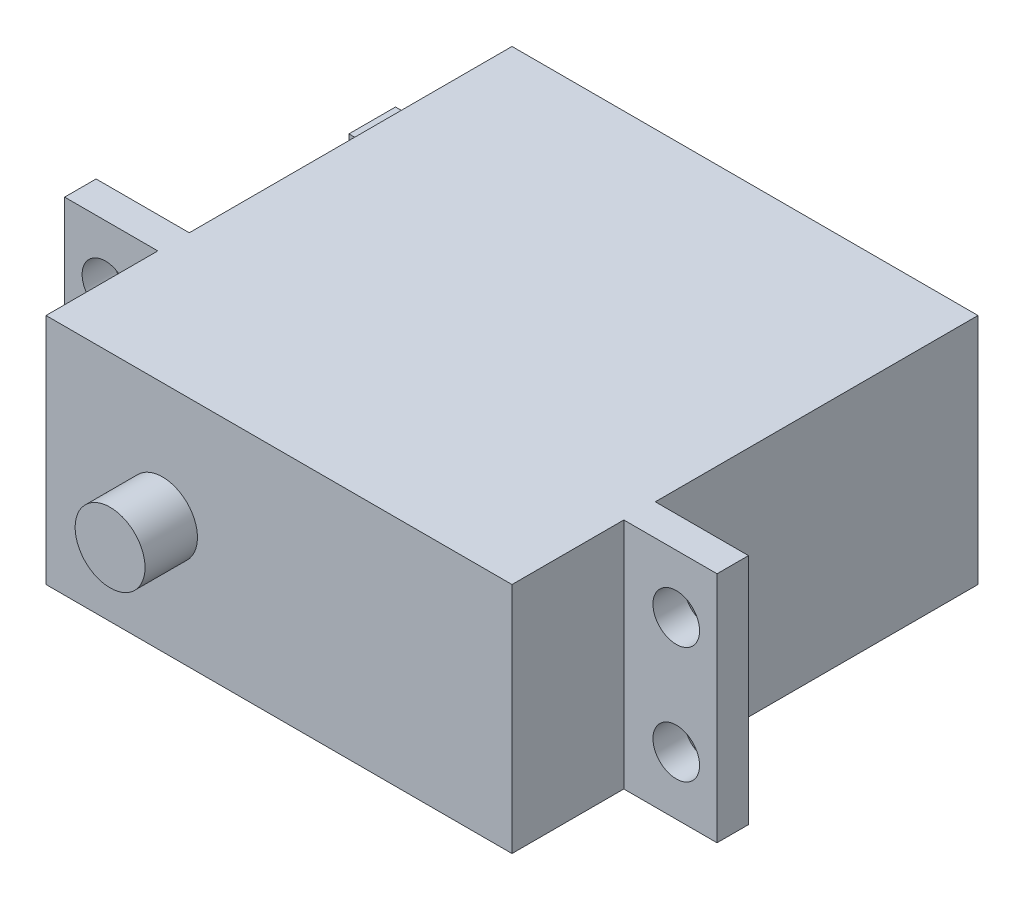
ISO-10303-21;
HEADER;
FILE_DESCRIPTION(('STEP AP214'),'2;1');
FILE_NAME('part.step','',(''),(''),'','','');
FILE_SCHEMA(('AUTOMOTIVE_DESIGN { 1 0 10303 214 1 1 1 1 }'));
ENDSEC;
DATA;
#1=APPLICATION_CONTEXT('core data for automotive mechanical design processes');
#2=APPLICATION_PROTOCOL_DEFINITION('international standard','automotive_design',2000,#1);
#3=PRODUCT_CONTEXT('',#1,'mechanical');
#4=PRODUCT('Part','Part','',(#3));
#5=PRODUCT_RELATED_PRODUCT_CATEGORY('part','',(#4));
#6=PRODUCT_DEFINITION_FORMATION('','',#4);
#7=PRODUCT_DEFINITION_CONTEXT('part definition',#1,'design');
#8=PRODUCT_DEFINITION('design','',#6,#7);
#9=PRODUCT_DEFINITION_SHAPE('','',#8);
#10=(LENGTH_UNIT() NAMED_UNIT(*) SI_UNIT(.MILLI.,.METRE.));
#11=(NAMED_UNIT(*) PLANE_ANGLE_UNIT() SI_UNIT($,.RADIAN.));
#12=(NAMED_UNIT(*) SI_UNIT($,.STERADIAN.) SOLID_ANGLE_UNIT());
#13=UNCERTAINTY_MEASURE_WITH_UNIT(LENGTH_MEASURE(1.E-05),#10,'distance_accuracy_value','');
#14=(GEOMETRIC_REPRESENTATION_CONTEXT(3) GLOBAL_UNCERTAINTY_ASSIGNED_CONTEXT((#13)) GLOBAL_UNIT_ASSIGNED_CONTEXT((#10,
#11,#12)) REPRESENTATION_CONTEXT('',''));
#15=CARTESIAN_POINT('',(0.,0.,0.));
#16=DIRECTION('',(0.,0.,1.));
#17=DIRECTION('',(1.,0.,0.));
#18=AXIS2_PLACEMENT_3D('',#15,#16,#17);
#19=CARTESIAN_POINT('',(0.,20.,0.));
#20=DIRECTION('',(1.,0.,0.));
#21=DIRECTION('',(0.,0.,-1.));
#22=AXIS2_PLACEMENT_3D('',#19,#20,#21);
#23=PLANE('',#22);
#24=DIRECTION('',(0.,-1.,0.));
#25=VECTOR('',#24,1.);
#26=CARTESIAN_POINT('',(-1.38777878078146E-13,0.,-12.3));
#27=LINE('',#26,#25);
#28=CARTESIAN_POINT('',(0.,20.,-12.3));
#29=VERTEX_POINT('',#28);
#30=CARTESIAN_POINT('',(-1.38777878078145E-13,2.22749336337148E-13,-12.3));
#31=VERTEX_POINT('',#30);
#32=EDGE_CURVE('E195',#29,#31,#27,.T.);
#33=ORIENTED_EDGE('',*,*,#32,.F.);
#34=DIRECTION('',(0.,0.,1.));
#35=VECTOR('',#34,1.);
#36=CARTESIAN_POINT('',(0.,20.,0.));
#37=LINE('',#36,#35);
#38=CARTESIAN_POINT('',(0.,20.,-40.));
#39=VERTEX_POINT('',#38);
#40=EDGE_CURVE('E304',#39,#29,#37,.T.);
#41=ORIENTED_EDGE('',*,*,#40,.F.);
#42=DIRECTION('',(0.,-1.,0.));
#43=VECTOR('',#42,1.);
#44=CARTESIAN_POINT('',(0.,20.,-40.));
#45=LINE('',#44,#43);
#46=CARTESIAN_POINT('',(0.,0.,-40.));
#47=VERTEX_POINT('',#46);
#48=EDGE_CURVE('E320',#39,#47,#45,.T.);
#49=ORIENTED_EDGE('',*,*,#48,.T.);
#50=DIRECTION('',(0.,0.,1.));
#51=VECTOR('',#50,1.);
#52=CARTESIAN_POINT('',(0.,0.,0.));
#53=LINE('',#52,#51);
#54=EDGE_CURVE('E321',#47,#31,#53,.T.);
#55=ORIENTED_EDGE('',*,*,#54,.T.);
#56=EDGE_LOOP('',(#33,#41,#49,#55));
#57=FACE_BOUND('',#56,.T.);
#58=DIRECTION('',(0.,0.,1.));
#59=VECTOR('',#58,1.);
#60=CARTESIAN_POINT('',(0.,6.5,0.));
#61=LINE('',#60,#59);
#62=CARTESIAN_POINT('',(0.,6.5,-37.));
#63=VERTEX_POINT('',#62);
#64=CARTESIAN_POINT('',(0.,6.5,-33.));
#65=VERTEX_POINT('',#64);
#66=EDGE_CURVE('E187',#63,#65,#61,.T.);
#67=ORIENTED_EDGE('',*,*,#66,.F.);
#68=DIRECTION('',(0.,1.,0.));
#69=VECTOR('',#68,1.);
#70=CARTESIAN_POINT('',(0.,0.,-37.));
#71=LINE('',#70,#69);
#72=CARTESIAN_POINT('',(0.,13.5,-37.));
#73=VERTEX_POINT('',#72);
#74=EDGE_CURVE('E183',#63,#73,#71,.T.);
#75=ORIENTED_EDGE('',*,*,#74,.T.);
#76=DIRECTION('',(0.,0.,1.));
#77=VECTOR('',#76,1.);
#78=CARTESIAN_POINT('',(0.,13.5,0.));
#79=LINE('',#78,#77);
#80=CARTESIAN_POINT('',(0.,13.5,-33.));
#81=VERTEX_POINT('',#80);
#82=EDGE_CURVE('E63',#73,#81,#79,.T.);
#83=ORIENTED_EDGE('',*,*,#82,.T.);
#84=DIRECTION('',(0.,1.,0.));
#85=VECTOR('',#84,1.);
#86=CARTESIAN_POINT('',(0.,0.,-33.));
#87=LINE('',#86,#85);
#88=EDGE_CURVE('E658',#65,#81,#87,.T.);
#89=ORIENTED_EDGE('',*,*,#88,.F.);
#90=EDGE_LOOP('',(#67,#75,#83,#89));
#91=FACE_BOUND('',#90,.T.);
#92=ADVANCED_FACE('F47',(#57,#91),#23,.F.);
#93=CARTESIAN_POINT('',(40.,20.,0.));
#94=DIRECTION('',(-1.,0.,0.));
#95=DIRECTION('',(0.,0.,1.));
#96=AXIS2_PLACEMENT_3D('',#93,#94,#95);
#97=PLANE('',#96);
#98=DIRECTION('',(0.,-1.,0.));
#99=VECTOR('',#98,1.);
#100=CARTESIAN_POINT('',(40.,0.,-9.6));
#101=LINE('',#100,#99);
#102=CARTESIAN_POINT('',(40.,20.,-9.6));
#103=VERTEX_POINT('',#102);
#104=CARTESIAN_POINT('',(40.,0.,-9.6));
#105=VERTEX_POINT('',#104);
#106=EDGE_CURVE('E205',#103,#105,#101,.T.);
#107=ORIENTED_EDGE('',*,*,#106,.F.);
#108=DIRECTION('',(0.,0.,-1.));
#109=VECTOR('',#108,1.);
#110=CARTESIAN_POINT('',(40.,20.,0.));
#111=LINE('',#110,#109);
#112=CARTESIAN_POINT('',(40.,20.,0.));
#113=VERTEX_POINT('',#112);
#114=EDGE_CURVE('E313',#113,#103,#111,.T.);
#115=ORIENTED_EDGE('',*,*,#114,.F.);
#116=DIRECTION('',(0.,-1.,0.));
#117=VECTOR('',#116,1.);
#118=CARTESIAN_POINT('',(40.,20.,0.));
#119=LINE('',#118,#117);
#120=CARTESIAN_POINT('',(40.,0.,0.));
#121=VERTEX_POINT('',#120);
#122=EDGE_CURVE('E342',#113,#121,#119,.T.);
#123=ORIENTED_EDGE('',*,*,#122,.T.);
#124=DIRECTION('',(0.,0.,-1.));
#125=VECTOR('',#124,1.);
#126=CARTESIAN_POINT('',(40.,0.,0.));
#127=LINE('',#126,#125);
#128=EDGE_CURVE('E329',#121,#105,#127,.T.);
#129=ORIENTED_EDGE('',*,*,#128,.T.);
#130=EDGE_LOOP('',(#107,#115,#123,#129));
#131=FACE_BOUND('',#130,.T.);
#132=ADVANCED_FACE('F364',(#131),#97,.F.);
#133=CARTESIAN_POINT('',(0.,20.,-9.6));
#134=VERTEX_POINT('',#133);
#135=CARTESIAN_POINT('',(0.,20.,0.));
#136=VERTEX_POINT('',#135);
#137=EDGE_CURVE('E309',#134,#136,#37,.T.);
#138=ORIENTED_EDGE('',*,*,#137,.F.);
#139=DIRECTION('',(0.,-1.,0.));
#140=VECTOR('',#139,1.);
#141=CARTESIAN_POINT('',(-1.38777878078146E-13,0.,-9.6));
#142=LINE('',#141,#140);
#143=CARTESIAN_POINT('',(0.,0.,-9.6));
#144=VERTEX_POINT('',#143);
#145=EDGE_CURVE('E259',#134,#144,#142,.T.);
#146=ORIENTED_EDGE('',*,*,#145,.T.);
#147=CARTESIAN_POINT('',(0.,0.,0.));
#148=VERTEX_POINT('',#147);
#149=EDGE_CURVE('E303',#144,#148,#53,.T.);
#150=ORIENTED_EDGE('',*,*,#149,.T.);
#151=DIRECTION('',(0.,-1.,0.));
#152=VECTOR('',#151,1.);
#153=CARTESIAN_POINT('',(0.,20.,0.));
#154=LINE('',#153,#152);
#155=EDGE_CURVE('E56',#136,#148,#154,.T.);
#156=ORIENTED_EDGE('',*,*,#155,.F.);
#157=EDGE_LOOP('',(#138,#146,#150,#156));
#158=FACE_BOUND('',#157,.T.);
#159=ADVANCED_FACE('F49',(#158),#23,.F.);
#160=CARTESIAN_POINT('',(0.,20.,0.));
#161=DIRECTION('',(0.,0.,-1.));
#162=DIRECTION('',(-1.,0.,0.));
#163=AXIS2_PLACEMENT_3D('',#160,#161,#162);
#164=PLANE('',#163);
#165=CARTESIAN_POINT('',(10.,10.,0.));
#166=DIRECTION('',(0.,0.,-1.));
#167=DIRECTION('',(-1.,0.,0.));
#168=AXIS2_PLACEMENT_3D('',#165,#166,#167);
#169=CIRCLE('',#168,3.);
#170=CARTESIAN_POINT('',(7.,10.,0.));
#171=VERTEX_POINT('',#170);
#172=EDGE_CURVE('E11',#171,#171,#169,.F.);
#173=ORIENTED_EDGE('',*,*,#172,.F.);
#174=EDGE_LOOP('',(#173));
#175=FACE_BOUND('',#174,.T.);
#176=DIRECTION('',(1.,0.,0.));
#177=VECTOR('',#176,1.);
#178=CARTESIAN_POINT('',(0.,0.,0.));
#179=LINE('',#178,#177);
#180=EDGE_CURVE('E325',#148,#121,#179,.T.);
#181=ORIENTED_EDGE('',*,*,#180,.T.);
#182=ORIENTED_EDGE('',*,*,#122,.F.);
#183=DIRECTION('',(1.,0.,0.));
#184=VECTOR('',#183,1.);
#185=CARTESIAN_POINT('',(0.,20.,0.));
#186=LINE('',#185,#184);
#187=EDGE_CURVE('E308',#136,#113,#186,.T.);
#188=ORIENTED_EDGE('',*,*,#187,.F.);
#189=ORIENTED_EDGE('',*,*,#155,.T.);
#190=EDGE_LOOP('',(#181,#182,#188,#189));
#191=FACE_BOUND('',#190,.T.);
#192=ADVANCED_FACE('F350',(#175,#191),#164,.F.);
#193=CARTESIAN_POINT('',(40.,20.,-12.3));
#194=VERTEX_POINT('',#193);
#195=CARTESIAN_POINT('',(40.,20.,-40.));
#196=VERTEX_POINT('',#195);
#197=EDGE_CURVE('E312',#194,#196,#111,.T.);
#198=ORIENTED_EDGE('',*,*,#197,.F.);
#199=DIRECTION('',(0.,-1.,0.));
#200=VECTOR('',#199,1.);
#201=CARTESIAN_POINT('',(40.,0.,-12.3));
#202=LINE('',#201,#200);
#203=CARTESIAN_POINT('',(40.,0.,-12.3));
#204=VERTEX_POINT('',#203);
#205=EDGE_CURVE('E230',#194,#204,#202,.T.);
#206=ORIENTED_EDGE('',*,*,#205,.T.);
#207=CARTESIAN_POINT('',(40.,0.,-40.));
#208=VERTEX_POINT('',#207);
#209=EDGE_CURVE('E328',#204,#208,#127,.T.);
#210=ORIENTED_EDGE('',*,*,#209,.T.);
#211=DIRECTION('',(0.,-1.,0.));
#212=VECTOR('',#211,1.);
#213=CARTESIAN_POINT('',(40.,20.,-40.));
#214=LINE('',#213,#212);
#215=EDGE_CURVE('E338',#196,#208,#214,.T.);
#216=ORIENTED_EDGE('',*,*,#215,.F.);
#217=EDGE_LOOP('',(#198,#206,#210,#216));
#218=FACE_BOUND('',#217,.T.);
#219=ADVANCED_FACE('F385',(#218),#97,.F.);
#220=CARTESIAN_POINT('',(0.,20.,-40.));
#221=DIRECTION('',(0.,0.,1.));
#222=DIRECTION('',(1.,0.,0.));
#223=AXIS2_PLACEMENT_3D('',#220,#221,#222);
#224=PLANE('',#223);
#225=DIRECTION('',(-1.,0.,0.));
#226=VECTOR('',#225,1.);
#227=CARTESIAN_POINT('',(0.,0.,-40.));
#228=LINE('',#227,#226);
#229=EDGE_CURVE('E332',#208,#47,#228,.T.);
#230=ORIENTED_EDGE('',*,*,#229,.T.);
#231=ORIENTED_EDGE('',*,*,#48,.F.);
#232=DIRECTION('',(-1.,0.,0.));
#233=VECTOR('',#232,1.);
#234=CARTESIAN_POINT('',(0.,20.,-40.));
#235=LINE('',#234,#233);
#236=EDGE_CURVE('E317',#196,#39,#235,.T.);
#237=ORIENTED_EDGE('',*,*,#236,.F.);
#238=ORIENTED_EDGE('',*,*,#215,.T.);
#239=EDGE_LOOP('',(#230,#231,#237,#238));
#240=FACE_BOUND('',#239,.T.);
#241=ADVANCED_FACE('F433',(#240),#224,.F.);
#242=CARTESIAN_POINT('',(0.,20.,0.));
#243=DIRECTION('',(0.,-1.,0.));
#244=DIRECTION('',(0.,0.,-1.));
#245=AXIS2_PLACEMENT_3D('',#242,#243,#244);
#246=PLANE('',#245);
#247=ORIENTED_EDGE('',*,*,#40,.T.);
#248=DIRECTION('',(-1.,0.,0.));
#249=VECTOR('',#248,1.);
#250=CARTESIAN_POINT('',(0.,20.,-12.3));
#251=LINE('',#250,#249);
#252=CARTESIAN_POINT('',(-8.00000000000001,20.,-12.3));
#253=VERTEX_POINT('',#252);
#254=EDGE_CURVE('E190',#29,#253,#251,.T.);
#255=ORIENTED_EDGE('',*,*,#254,.T.);
#256=DIRECTION('',(0.,0.,-1.));
#257=VECTOR('',#256,1.);
#258=CARTESIAN_POINT('',(-8.00000000000001,20.,-9.6));
#259=LINE('',#258,#257);
#260=CARTESIAN_POINT('',(-8.00000000000001,20.,-9.6));
#261=VERTEX_POINT('',#260);
#262=EDGE_CURVE('E231',#261,#253,#259,.T.);
#263=ORIENTED_EDGE('',*,*,#262,.F.);
#264=DIRECTION('',(-1.,0.,0.));
#265=VECTOR('',#264,1.);
#266=CARTESIAN_POINT('',(0.,20.,-9.6));
#267=LINE('',#266,#265);
#268=EDGE_CURVE('E255',#134,#261,#267,.T.);
#269=ORIENTED_EDGE('',*,*,#268,.F.);
#270=ORIENTED_EDGE('',*,*,#137,.T.);
#271=ORIENTED_EDGE('',*,*,#187,.T.);
#272=ORIENTED_EDGE('',*,*,#114,.T.);
#273=DIRECTION('',(1.,0.,0.));
#274=VECTOR('',#273,1.);
#275=CARTESIAN_POINT('',(0.,20.,-9.6));
#276=LINE('',#275,#274);
#277=CARTESIAN_POINT('',(48.,20.,-9.6));
#278=VERTEX_POINT('',#277);
#279=EDGE_CURVE('E210',#103,#278,#276,.T.);
#280=ORIENTED_EDGE('',*,*,#279,.T.);
#281=DIRECTION('',(0.,0.,-1.));
#282=VECTOR('',#281,1.);
#283=CARTESIAN_POINT('',(48.,20.,-9.6));
#284=LINE('',#283,#282);
#285=CARTESIAN_POINT('',(48.,20.,-12.3));
#286=VERTEX_POINT('',#285);
#287=EDGE_CURVE('E225',#278,#286,#284,.T.);
#288=ORIENTED_EDGE('',*,*,#287,.T.);
#289=DIRECTION('',(1.,0.,0.));
#290=VECTOR('',#289,1.);
#291=CARTESIAN_POINT('',(0.,20.,-12.3));
#292=LINE('',#291,#290);
#293=EDGE_CURVE('E234',#194,#286,#292,.T.);
#294=ORIENTED_EDGE('',*,*,#293,.F.);
#295=ORIENTED_EDGE('',*,*,#197,.T.);
#296=ORIENTED_EDGE('',*,*,#236,.T.);
#297=EDGE_LOOP('',(#247,#255,#263,#269,#270,#271,#272,#280,#288,#294,#295,#296));
#298=FACE_BOUND('',#297,.T.);
#299=ADVANCED_FACE('F368',(#298),#246,.F.);
#300=CARTESIAN_POINT('',(0.,0.,0.));
#301=DIRECTION('',(0.,-1.,0.));
#302=DIRECTION('',(0.,0.,-1.));
#303=AXIS2_PLACEMENT_3D('',#300,#301,#302);
#304=PLANE('',#303);
#305=ORIENTED_EDGE('',*,*,#54,.F.);
#306=ORIENTED_EDGE('',*,*,#229,.F.);
#307=ORIENTED_EDGE('',*,*,#209,.F.);
#308=DIRECTION('',(1.,0.,0.));
#309=VECTOR('',#308,1.);
#310=CARTESIAN_POINT('',(0.,0.,-12.3));
#311=LINE('',#310,#309);
#312=CARTESIAN_POINT('',(48.,0.,-12.3));
#313=VERTEX_POINT('',#312);
#314=EDGE_CURVE('E242',#204,#313,#311,.T.);
#315=ORIENTED_EDGE('',*,*,#314,.T.);
#316=DIRECTION('',(0.,0.,-1.));
#317=VECTOR('',#316,1.);
#318=CARTESIAN_POINT('',(48.,0.,-9.6));
#319=LINE('',#318,#317);
#320=CARTESIAN_POINT('',(48.,0.,-9.6));
#321=VERTEX_POINT('',#320);
#322=EDGE_CURVE('E249',#321,#313,#319,.T.);
#323=ORIENTED_EDGE('',*,*,#322,.F.);
#324=DIRECTION('',(1.,0.,0.));
#325=VECTOR('',#324,1.);
#326=CARTESIAN_POINT('',(0.,0.,-9.6));
#327=LINE('',#326,#325);
#328=EDGE_CURVE('E218',#105,#321,#327,.T.);
#329=ORIENTED_EDGE('',*,*,#328,.F.);
#330=ORIENTED_EDGE('',*,*,#128,.F.);
#331=ORIENTED_EDGE('',*,*,#180,.F.);
#332=ORIENTED_EDGE('',*,*,#149,.F.);
#333=DIRECTION('',(-1.,0.,0.));
#334=VECTOR('',#333,1.);
#335=CARTESIAN_POINT('',(0.,2.22749336337147E-13,-9.6));
#336=LINE('',#335,#334);
#337=CARTESIAN_POINT('',(-8.00000000000014,2.18300171945875E-13,-9.6));
#338=VERTEX_POINT('',#337);
#339=EDGE_CURVE('E71',#144,#338,#336,.T.);
#340=ORIENTED_EDGE('',*,*,#339,.T.);
#341=DIRECTION('',(0.,0.,-1.));
#342=VECTOR('',#341,1.);
#343=CARTESIAN_POINT('',(-8.00000000000014,2.18300171945875E-13,-9.6));
#344=LINE('',#343,#342);
#345=CARTESIAN_POINT('',(-8.00000000000014,2.18300171945875E-13,-12.3));
#346=VERTEX_POINT('',#345);
#347=EDGE_CURVE('E275',#338,#346,#344,.T.);
#348=ORIENTED_EDGE('',*,*,#347,.T.);
#349=DIRECTION('',(-1.,0.,0.));
#350=VECTOR('',#349,1.);
#351=CARTESIAN_POINT('',(0.,2.22749336337147E-13,-12.3));
#352=LINE('',#351,#350);
#353=EDGE_CURVE('E280',#31,#346,#352,.T.);
#354=ORIENTED_EDGE('',*,*,#353,.F.);
#355=EDGE_LOOP('',(#305,#306,#307,#315,#323,#329,#330,#331,#332,#340,#348,#354));
#356=FACE_BOUND('',#355,.T.);
#357=ADVANCED_FACE('F360',(#356),#304,.T.);
#358=CARTESIAN_POINT('',(10.,10.,4.5));
#359=DIRECTION('',(0.,0.,-1.));
#360=DIRECTION('',(-1.,0.,0.));
#361=AXIS2_PLACEMENT_3D('',#358,#359,#360);
#362=CYLINDRICAL_SURFACE('',#361,3.);
#363=CARTESIAN_POINT('',(10.,10.,4.5));
#364=DIRECTION('',(0.,0.,1.));
#365=DIRECTION('',(1.,0.,0.));
#366=AXIS2_PLACEMENT_3D('',#363,#364,#365);
#367=CIRCLE('',#366,3.);
#368=CARTESIAN_POINT('',(13.,10.,4.5));
#369=VERTEX_POINT('',#368);
#370=EDGE_CURVE('E252',#369,#369,#367,.T.);
#371=ORIENTED_EDGE('',*,*,#370,.F.);
#372=EDGE_LOOP('',(#371));
#373=FACE_BOUND('',#372,.T.);
#374=ORIENTED_EDGE('',*,*,#172,.T.);
#375=EDGE_LOOP('',(#374));
#376=FACE_BOUND('',#375,.T.);
#377=ADVANCED_FACE('F440',(#373,#376),#362,.T.);
#378=CARTESIAN_POINT('',(0.,0.,4.5));
#379=DIRECTION('',(0.,0.,1.));
#380=DIRECTION('',(1.,0.,0.));
#381=AXIS2_PLACEMENT_3D('',#378,#379,#380);
#382=PLANE('',#381);
#383=ORIENTED_EDGE('',*,*,#370,.T.);
#384=EDGE_LOOP('',(#383));
#385=FACE_BOUND('',#384,.T.);
#386=ADVANCED_FACE('F444',(#385),#382,.T.);
#387=CARTESIAN_POINT('',(48.,0.,-9.6));
#388=DIRECTION('',(1.,0.,0.));
#389=DIRECTION('',(0.,0.,-1.));
#390=AXIS2_PLACEMENT_3D('',#387,#388,#389);
#391=PLANE('',#390);
#392=DIRECTION('',(0.,-1.,0.));
#393=VECTOR('',#392,1.);
#394=CARTESIAN_POINT('',(48.,0.,-12.3));
#395=LINE('',#394,#393);
#396=EDGE_CURVE('E238',#286,#313,#395,.T.);
#397=ORIENTED_EDGE('',*,*,#396,.F.);
#398=ORIENTED_EDGE('',*,*,#287,.F.);
#399=DIRECTION('',(0.,-1.,0.));
#400=VECTOR('',#399,1.);
#401=CARTESIAN_POINT('',(48.,0.,-9.6));
#402=LINE('',#401,#400);
#403=EDGE_CURVE('E214',#278,#321,#402,.T.);
#404=ORIENTED_EDGE('',*,*,#403,.T.);
#405=ORIENTED_EDGE('',*,*,#322,.T.);
#406=EDGE_LOOP('',(#397,#398,#404,#405));
#407=FACE_BOUND('',#406,.T.);
#408=ADVANCED_FACE('F375',(#407),#391,.T.);
#409=CARTESIAN_POINT('',(44.5,15.,-9.6));
#410=DIRECTION('',(0.,0.,-1.));
#411=DIRECTION('',(-1.,0.,0.));
#412=AXIS2_PLACEMENT_3D('',#409,#410,#411);
#413=CYLINDRICAL_SURFACE('',#412,2.);
#414=CARTESIAN_POINT('',(44.5,15.,-9.6));
#415=DIRECTION('',(0.,0.,-1.));
#416=DIRECTION('',(-1.,0.,0.));
#417=AXIS2_PLACEMENT_3D('',#414,#415,#416);
#418=CIRCLE('',#417,2.);
#419=CARTESIAN_POINT('',(42.5,15.,-9.6));
#420=VERTEX_POINT('',#419);
#421=EDGE_CURVE('E201',#420,#420,#418,.T.);
#422=CARTESIAN_POINT('',(44.5,15.,-12.3));
#423=DIRECTION('',(0.,0.,-1.));
#424=DIRECTION('',(-1.,0.,0.));
#425=AXIS2_PLACEMENT_3D('',#422,#423,#424);
#426=CIRCLE('',#425,2.);
#427=CARTESIAN_POINT('',(42.5,15.,-12.3));
#428=VERTEX_POINT('',#427);
#429=EDGE_CURVE('E226',#428,#428,#426,.T.);
#430=CARTESIAN_POINT('',(42.5,15.,-9.6));
#431=CARTESIAN_POINT('',(42.5,15.,-9.628125));
#432=CARTESIAN_POINT('',(42.5,15.,-9.65625));
#433=CARTESIAN_POINT('',(42.5,15.,-9.7125));
#434=CARTESIAN_POINT('',(42.5,15.,-9.740625));
#435=CARTESIAN_POINT('',(42.5,15.,-9.796875));
#436=CARTESIAN_POINT('',(42.5,15.,-9.825));
#437=CARTESIAN_POINT('',(42.5,15.,-9.88125));
#438=CARTESIAN_POINT('',(42.5,15.,-9.909375));
#439=CARTESIAN_POINT('',(42.5,15.,-9.965625));
#440=CARTESIAN_POINT('',(42.5,15.,-9.99375));
#441=CARTESIAN_POINT('',(42.5,15.,-10.05));
#442=CARTESIAN_POINT('',(42.5,15.,-10.078125));
#443=CARTESIAN_POINT('',(42.5,15.,-10.134375));
#444=CARTESIAN_POINT('',(42.5,15.,-10.1625));
#445=CARTESIAN_POINT('',(42.5,15.,-10.21875));
#446=CARTESIAN_POINT('',(42.5,15.,-10.246875));
#447=CARTESIAN_POINT('',(42.5,15.,-10.303125));
#448=CARTESIAN_POINT('',(42.5,15.,-10.33125));
#449=CARTESIAN_POINT('',(42.5,15.,-10.3875));
#450=CARTESIAN_POINT('',(42.5,15.,-10.415625));
#451=CARTESIAN_POINT('',(42.5,15.,-10.471875));
#452=CARTESIAN_POINT('',(42.5,15.,-10.5));
#453=CARTESIAN_POINT('',(42.5,15.,-10.55625));
#454=CARTESIAN_POINT('',(42.5,15.,-10.584375));
#455=CARTESIAN_POINT('',(42.5,15.,-10.640625));
#456=CARTESIAN_POINT('',(42.5,15.,-10.66875));
#457=CARTESIAN_POINT('',(42.5,15.,-10.725));
#458=CARTESIAN_POINT('',(42.5,15.,-10.753125));
#459=CARTESIAN_POINT('',(42.5,15.,-10.809375));
#460=CARTESIAN_POINT('',(42.5,15.,-10.8375));
#461=CARTESIAN_POINT('',(42.5,15.,-10.89375));
#462=CARTESIAN_POINT('',(42.5,15.,-10.921875));
#463=CARTESIAN_POINT('',(42.5,15.,-10.978125));
#464=CARTESIAN_POINT('',(42.5,15.,-11.00625));
#465=CARTESIAN_POINT('',(42.5,15.,-11.0625));
#466=CARTESIAN_POINT('',(42.5,15.,-11.090625));
#467=CARTESIAN_POINT('',(42.5,15.,-11.146875));
#468=CARTESIAN_POINT('',(42.5,15.,-11.175));
#469=CARTESIAN_POINT('',(42.5,15.,-11.23125));
#470=CARTESIAN_POINT('',(42.5,15.,-11.259375));
#471=CARTESIAN_POINT('',(42.5,15.,-11.315625));
#472=CARTESIAN_POINT('',(42.5,15.,-11.34375));
#473=CARTESIAN_POINT('',(42.5,15.,-11.4));
#474=CARTESIAN_POINT('',(42.5,15.,-11.428125));
#475=CARTESIAN_POINT('',(42.5,15.,-11.484375));
#476=CARTESIAN_POINT('',(42.5,15.,-11.5125));
#477=CARTESIAN_POINT('',(42.5,15.,-11.56875));
#478=CARTESIAN_POINT('',(42.5,15.,-11.596875));
#479=CARTESIAN_POINT('',(42.5,15.,-11.653125));
#480=CARTESIAN_POINT('',(42.5,15.,-11.68125));
#481=CARTESIAN_POINT('',(42.5,15.,-11.7375));
#482=CARTESIAN_POINT('',(42.5,15.,-11.765625));
#483=CARTESIAN_POINT('',(42.5,15.,-11.821875));
#484=CARTESIAN_POINT('',(42.5,15.,-11.85));
#485=CARTESIAN_POINT('',(42.5,15.,-11.90625));
#486=CARTESIAN_POINT('',(42.5,15.,-11.934375));
#487=CARTESIAN_POINT('',(42.5,15.,-11.990625));
#488=CARTESIAN_POINT('',(42.5,15.,-12.01875));
#489=CARTESIAN_POINT('',(42.5,15.,-12.075));
#490=CARTESIAN_POINT('',(42.5,15.,-12.103125));
#491=CARTESIAN_POINT('',(42.5,15.,-12.159375));
#492=CARTESIAN_POINT('',(42.5,15.,-12.1875));
#493=CARTESIAN_POINT('',(42.5,15.,-12.24375));
#494=CARTESIAN_POINT('',(42.5,15.,-12.271875));
#495=CARTESIAN_POINT('',(42.5,15.,-12.3));
#496=B_SPLINE_CURVE_WITH_KNOTS('',3,(#430,#431,#432,#433,#434,#435,#436,#437,#438,#439,#440,
#441,#442,#443,#444,#445,#446,#447,#448,#449,#450,#451,#452,#453,#454,#455,#456,#457,#458,#459,
#460,#461,#462,#463,#464,#465,#466,#467,#468,#469,#470,#471,#472,#473,#474,#475,#476,#477,#478,
#479,#480,#481,#482,#483,#484,#485,#486,#487,#488,#489,#490,#491,#492,#493,#494,#495),
.UNSPECIFIED.,.F.,.F.,(4,2,2,2,2,2,2,2,2,2,2,2,2,2,2,2,2,2,2,2,2,2,2,2,2,2,2,2,2,2,2,2,4),(0.,
0.0843750000000011,0.168750000000001,0.253125000000002,0.337500000000001,0.421875,
0.506250000000002,0.590625000000001,0.675,0.759375000000001,0.843750000000001,0.928125000000002,
1.0125,1.096875,1.18125,1.265625,1.35,1.434375,1.51875,1.603125,1.6875,1.771875,1.85625,
1.940625,2.025,2.109375,2.19375,2.278125,2.3625,2.446875,2.53125,2.615625,2.7),.UNSPECIFIED.);
#497=EDGE_CURVE('BSEAM534',#420,#428,#496,.T.);
#498=ORIENTED_EDGE('',*,*,#421,.F.);
#499=ORIENTED_EDGE('',*,*,#429,.T.);
#500=ORIENTED_EDGE('',*,*,#497,.T.);
#501=ORIENTED_EDGE('',*,*,#497,.F.);
#502=EDGE_LOOP('',(#498,#500,#499,#501));
#503=FACE_BOUND('',#502,.T.);
#504=ADVANCED_FACE('F534',(#503),#413,.F.);
#505=CARTESIAN_POINT('',(44.5,5.,-9.6));
#506=DIRECTION('',(0.,0.,-1.));
#507=DIRECTION('',(-1.,0.,0.));
#508=AXIS2_PLACEMENT_3D('',#505,#506,#507);
#509=CYLINDRICAL_SURFACE('',#508,2.);
#510=CARTESIAN_POINT('',(44.5,5.,-9.6));
#511=DIRECTION('',(0.,0.,-1.));
#512=DIRECTION('',(-1.,0.,0.));
#513=AXIS2_PLACEMENT_3D('',#510,#511,#512);
#514=CIRCLE('',#513,2.);
#515=CARTESIAN_POINT('',(42.5,5.,-9.6));
#516=VERTEX_POINT('',#515);
#517=EDGE_CURVE('E221',#516,#516,#514,.F.);
#518=CARTESIAN_POINT('',(44.5,5.,-12.3));
#519=DIRECTION('',(0.,0.,-1.));
#520=DIRECTION('',(-1.,0.,0.));
#521=AXIS2_PLACEMENT_3D('',#518,#519,#520);
#522=CIRCLE('',#521,2.);
#523=CARTESIAN_POINT('',(42.5,5.,-12.3));
#524=VERTEX_POINT('',#523);
#525=EDGE_CURVE('E206',#524,#524,#522,.F.);
#526=CARTESIAN_POINT('',(42.5,5.,-9.6));
#527=CARTESIAN_POINT('',(42.5,5.,-9.628125));
#528=CARTESIAN_POINT('',(42.5,5.,-9.65625));
#529=CARTESIAN_POINT('',(42.5,5.,-9.7125));
#530=CARTESIAN_POINT('',(42.5,5.,-9.740625));
#531=CARTESIAN_POINT('',(42.5,5.,-9.796875));
#532=CARTESIAN_POINT('',(42.5,5.,-9.825));
#533=CARTESIAN_POINT('',(42.5,5.,-9.88125));
#534=CARTESIAN_POINT('',(42.5,5.,-9.909375));
#535=CARTESIAN_POINT('',(42.5,5.,-9.965625));
#536=CARTESIAN_POINT('',(42.5,5.,-9.99375));
#537=CARTESIAN_POINT('',(42.5,5.,-10.05));
#538=CARTESIAN_POINT('',(42.5,5.,-10.078125));
#539=CARTESIAN_POINT('',(42.5,5.,-10.134375));
#540=CARTESIAN_POINT('',(42.5,5.,-10.1625));
#541=CARTESIAN_POINT('',(42.5,5.,-10.21875));
#542=CARTESIAN_POINT('',(42.5,5.,-10.246875));
#543=CARTESIAN_POINT('',(42.5,5.,-10.303125));
#544=CARTESIAN_POINT('',(42.5,5.,-10.33125));
#545=CARTESIAN_POINT('',(42.5,5.,-10.3875));
#546=CARTESIAN_POINT('',(42.5,5.,-10.415625));
#547=CARTESIAN_POINT('',(42.5,5.,-10.471875));
#548=CARTESIAN_POINT('',(42.5,5.,-10.5));
#549=CARTESIAN_POINT('',(42.5,5.,-10.55625));
#550=CARTESIAN_POINT('',(42.5,5.,-10.584375));
#551=CARTESIAN_POINT('',(42.5,5.,-10.640625));
#552=CARTESIAN_POINT('',(42.5,5.,-10.66875));
#553=CARTESIAN_POINT('',(42.5,5.,-10.725));
#554=CARTESIAN_POINT('',(42.5,5.,-10.753125));
#555=CARTESIAN_POINT('',(42.5,5.,-10.809375));
#556=CARTESIAN_POINT('',(42.5,5.,-10.8375));
#557=CARTESIAN_POINT('',(42.5,5.,-10.89375));
#558=CARTESIAN_POINT('',(42.5,5.,-10.921875));
#559=CARTESIAN_POINT('',(42.5,5.,-10.978125));
#560=CARTESIAN_POINT('',(42.5,5.,-11.00625));
#561=CARTESIAN_POINT('',(42.5,5.,-11.0625));
#562=CARTESIAN_POINT('',(42.5,5.,-11.090625));
#563=CARTESIAN_POINT('',(42.5,5.,-11.146875));
#564=CARTESIAN_POINT('',(42.5,5.,-11.175));
#565=CARTESIAN_POINT('',(42.5,5.,-11.23125));
#566=CARTESIAN_POINT('',(42.5,5.,-11.259375));
#567=CARTESIAN_POINT('',(42.5,5.,-11.315625));
#568=CARTESIAN_POINT('',(42.5,5.,-11.34375));
#569=CARTESIAN_POINT('',(42.5,5.,-11.4));
#570=CARTESIAN_POINT('',(42.5,5.,-11.428125));
#571=CARTESIAN_POINT('',(42.5,5.,-11.484375));
#572=CARTESIAN_POINT('',(42.5,5.,-11.5125));
#573=CARTESIAN_POINT('',(42.5,5.,-11.56875));
#574=CARTESIAN_POINT('',(42.5,5.,-11.596875));
#575=CARTESIAN_POINT('',(42.5,5.,-11.653125));
#576=CARTESIAN_POINT('',(42.5,5.,-11.68125));
#577=CARTESIAN_POINT('',(42.5,5.,-11.7375));
#578=CARTESIAN_POINT('',(42.5,5.,-11.765625));
#579=CARTESIAN_POINT('',(42.5,5.,-11.821875));
#580=CARTESIAN_POINT('',(42.5,5.,-11.85));
#581=CARTESIAN_POINT('',(42.5,5.,-11.90625));
#582=CARTESIAN_POINT('',(42.5,5.,-11.934375));
#583=CARTESIAN_POINT('',(42.5,5.,-11.990625));
#584=CARTESIAN_POINT('',(42.5,5.,-12.01875));
#585=CARTESIAN_POINT('',(42.5,5.,-12.075));
#586=CARTESIAN_POINT('',(42.5,5.,-12.103125));
#587=CARTESIAN_POINT('',(42.5,5.,-12.159375));
#588=CARTESIAN_POINT('',(42.5,5.,-12.1875));
#589=CARTESIAN_POINT('',(42.5,5.,-12.24375));
#590=CARTESIAN_POINT('',(42.5,5.,-12.271875));
#591=CARTESIAN_POINT('',(42.5,5.,-12.3));
#592=B_SPLINE_CURVE_WITH_KNOTS('',3,(#526,#527,#528,#529,#530,#531,#532,#533,#534,#535,#536,
#537,#538,#539,#540,#541,#542,#543,#544,#545,#546,#547,#548,#549,#550,#551,#552,#553,#554,#555,
#556,#557,#558,#559,#560,#561,#562,#563,#564,#565,#566,#567,#568,#569,#570,#571,#572,#573,#574,
#575,#576,#577,#578,#579,#580,#581,#582,#583,#584,#585,#586,#587,#588,#589,#590,#591),
.UNSPECIFIED.,.F.,.F.,(4,2,2,2,2,2,2,2,2,2,2,2,2,2,2,2,2,2,2,2,2,2,2,2,2,2,2,2,2,2,2,2,4),(0.,
0.0843750000000011,0.168750000000001,0.253125000000002,0.337500000000001,0.421875,
0.506250000000002,0.590625000000001,0.675,0.759375000000001,0.843750000000001,0.928125000000002,
1.0125,1.096875,1.18125,1.265625,1.35,1.434375,1.51875,1.603125,1.6875,1.771875,1.85625,
1.940625,2.025,2.109375,2.19375,2.278125,2.3625,2.446875,2.53125,2.615625,2.7),.UNSPECIFIED.);
#593=EDGE_CURVE('BSEAM528',#516,#524,#592,.T.);
#594=ORIENTED_EDGE('',*,*,#517,.T.);
#595=ORIENTED_EDGE('',*,*,#525,.F.);
#596=ORIENTED_EDGE('',*,*,#593,.T.);
#597=ORIENTED_EDGE('',*,*,#593,.F.);
#598=EDGE_LOOP('',(#594,#596,#595,#597));
#599=FACE_BOUND('',#598,.T.);
#600=ADVANCED_FACE('F528',(#599),#509,.F.);
#601=CARTESIAN_POINT('',(0.,0.,-9.6));
#602=DIRECTION('',(0.,0.,-1.));
#603=DIRECTION('',(-1.,0.,0.));
#604=AXIS2_PLACEMENT_3D('',#601,#602,#603);
#605=PLANE('',#604);
#606=ORIENTED_EDGE('',*,*,#421,.T.);
#607=EDGE_LOOP('',(#606));
#608=FACE_BOUND('',#607,.T.);
#609=ORIENTED_EDGE('',*,*,#106,.T.);
#610=ORIENTED_EDGE('',*,*,#328,.T.);
#611=ORIENTED_EDGE('',*,*,#403,.F.);
#612=ORIENTED_EDGE('',*,*,#279,.F.);
#613=EDGE_LOOP('',(#609,#610,#611,#612));
#614=FACE_BOUND('',#613,.T.);
#615=ORIENTED_EDGE('',*,*,#517,.F.);
#616=EDGE_LOOP('',(#615));
#617=FACE_BOUND('',#616,.T.);
#618=ADVANCED_FACE('F371',(#608,#614,#617),#605,.F.);
#619=CARTESIAN_POINT('',(0.,0.,-12.3));
#620=DIRECTION('',(0.,0.,-1.));
#621=DIRECTION('',(-1.,0.,0.));
#622=AXIS2_PLACEMENT_3D('',#619,#620,#621);
#623=PLANE('',#622);
#624=ORIENTED_EDGE('',*,*,#429,.F.);
#625=EDGE_LOOP('',(#624));
#626=FACE_BOUND('',#625,.T.);
#627=ORIENTED_EDGE('',*,*,#205,.F.);
#628=ORIENTED_EDGE('',*,*,#293,.T.);
#629=ORIENTED_EDGE('',*,*,#396,.T.);
#630=ORIENTED_EDGE('',*,*,#314,.F.);
#631=EDGE_LOOP('',(#627,#628,#629,#630));
#632=FACE_BOUND('',#631,.T.);
#633=ORIENTED_EDGE('',*,*,#525,.T.);
#634=EDGE_LOOP('',(#633));
#635=FACE_BOUND('',#634,.T.);
#636=ADVANCED_FACE('F380',(#626,#632,#635),#623,.T.);
#637=CARTESIAN_POINT('',(-8.00000000000014,0.,-9.6));
#638=DIRECTION('',(1.,0.,0.));
#639=DIRECTION('',(0.,1.,0.));
#640=AXIS2_PLACEMENT_3D('',#637,#638,#639);
#641=PLANE('',#640);
#642=DIRECTION('',(0.,-1.,0.));
#643=VECTOR('',#642,1.);
#644=CARTESIAN_POINT('',(-8.00000000000014,0.,-12.3));
#645=LINE('',#644,#643);
#646=EDGE_CURVE('E284',#253,#346,#645,.T.);
#647=ORIENTED_EDGE('',*,*,#646,.T.);
#648=ORIENTED_EDGE('',*,*,#347,.F.);
#649=DIRECTION('',(0.,-1.,0.));
#650=VECTOR('',#649,1.);
#651=CARTESIAN_POINT('',(-8.00000000000014,0.,-9.6));
#652=LINE('',#651,#650);
#653=EDGE_CURVE('E265',#261,#338,#652,.T.);
#654=ORIENTED_EDGE('',*,*,#653,.F.);
#655=ORIENTED_EDGE('',*,*,#262,.T.);
#656=EDGE_LOOP('',(#647,#648,#654,#655));
#657=FACE_BOUND('',#656,.T.);
#658=ADVANCED_FACE('F449',(#657),#641,.F.);
#659=CARTESIAN_POINT('',(-4.5000000000001,5.00000000000022,-9.6));
#660=DIRECTION('',(0.,0.,-1.));
#661=DIRECTION('',(-1.,0.,0.));
#662=AXIS2_PLACEMENT_3D('',#659,#660,#661);
#663=CYLINDRICAL_SURFACE('',#662,2.);
#664=CARTESIAN_POINT('',(-4.5000000000001,5.00000000000022,-9.6));
#665=DIRECTION('',(0.,0.,-1.));
#666=DIRECTION('',(-1.,0.,0.));
#667=AXIS2_PLACEMENT_3D('',#664,#665,#666);
#668=CIRCLE('',#667,2.);
#669=CARTESIAN_POINT('',(-6.5000000000001,5.00000000000022,-9.6));
#670=VERTEX_POINT('',#669);
#671=EDGE_CURVE('E268',#670,#670,#668,.T.);
#672=CARTESIAN_POINT('',(-4.5000000000001,5.00000000000022,-12.3));
#673=DIRECTION('',(0.,0.,-1.));
#674=DIRECTION('',(-1.,0.,0.));
#675=AXIS2_PLACEMENT_3D('',#672,#673,#674);
#676=CIRCLE('',#675,2.);
#677=CARTESIAN_POINT('',(-6.5000000000001,5.00000000000022,-12.3));
#678=VERTEX_POINT('',#677);
#679=EDGE_CURVE('E288',#678,#678,#676,.T.);
#680=CARTESIAN_POINT('',(-6.5000000000001,5.00000000000022,-9.6));
#681=CARTESIAN_POINT('',(-6.5000000000001,5.00000000000022,-9.628125));
#682=CARTESIAN_POINT('',(-6.5000000000001,5.00000000000022,-9.65625));
#683=CARTESIAN_POINT('',(-6.5000000000001,5.00000000000022,-9.7125));
#684=CARTESIAN_POINT('',(-6.5000000000001,5.00000000000022,-9.740625));
#685=CARTESIAN_POINT('',(-6.5000000000001,5.00000000000022,-9.796875));
#686=CARTESIAN_POINT('',(-6.5000000000001,5.00000000000022,-9.825));
#687=CARTESIAN_POINT('',(-6.5000000000001,5.00000000000022,-9.88125));
#688=CARTESIAN_POINT('',(-6.5000000000001,5.00000000000022,-9.909375));
#689=CARTESIAN_POINT('',(-6.5000000000001,5.00000000000022,-9.965625));
#690=CARTESIAN_POINT('',(-6.5000000000001,5.00000000000022,-9.99375));
#691=CARTESIAN_POINT('',(-6.5000000000001,5.00000000000022,-10.05));
#692=CARTESIAN_POINT('',(-6.5000000000001,5.00000000000022,-10.078125));
#693=CARTESIAN_POINT('',(-6.5000000000001,5.00000000000022,-10.134375));
#694=CARTESIAN_POINT('',(-6.5000000000001,5.00000000000022,-10.1625));
#695=CARTESIAN_POINT('',(-6.5000000000001,5.00000000000022,-10.21875));
#696=CARTESIAN_POINT('',(-6.5000000000001,5.00000000000022,-10.246875));
#697=CARTESIAN_POINT('',(-6.5000000000001,5.00000000000022,-10.303125));
#698=CARTESIAN_POINT('',(-6.5000000000001,5.00000000000022,-10.33125));
#699=CARTESIAN_POINT('',(-6.5000000000001,5.00000000000022,-10.3875));
#700=CARTESIAN_POINT('',(-6.5000000000001,5.00000000000022,-10.415625));
#701=CARTESIAN_POINT('',(-6.5000000000001,5.00000000000022,-10.471875));
#702=CARTESIAN_POINT('',(-6.5000000000001,5.00000000000022,-10.5));
#703=CARTESIAN_POINT('',(-6.5000000000001,5.00000000000022,-10.55625));
#704=CARTESIAN_POINT('',(-6.5000000000001,5.00000000000022,-10.584375));
#705=CARTESIAN_POINT('',(-6.5000000000001,5.00000000000022,-10.640625));
#706=CARTESIAN_POINT('',(-6.5000000000001,5.00000000000022,-10.66875));
#707=CARTESIAN_POINT('',(-6.5000000000001,5.00000000000022,-10.725));
#708=CARTESIAN_POINT('',(-6.5000000000001,5.00000000000022,-10.753125));
#709=CARTESIAN_POINT('',(-6.5000000000001,5.00000000000022,-10.809375));
#710=CARTESIAN_POINT('',(-6.5000000000001,5.00000000000022,-10.8375));
#711=CARTESIAN_POINT('',(-6.5000000000001,5.00000000000022,-10.89375));
#712=CARTESIAN_POINT('',(-6.5000000000001,5.00000000000022,-10.921875));
#713=CARTESIAN_POINT('',(-6.5000000000001,5.00000000000022,-10.978125));
#714=CARTESIAN_POINT('',(-6.5000000000001,5.00000000000022,-11.00625));
#715=CARTESIAN_POINT('',(-6.5000000000001,5.00000000000022,-11.0625));
#716=CARTESIAN_POINT('',(-6.5000000000001,5.00000000000022,-11.090625));
#717=CARTESIAN_POINT('',(-6.5000000000001,5.00000000000022,-11.146875));
#718=CARTESIAN_POINT('',(-6.5000000000001,5.00000000000022,-11.175));
#719=CARTESIAN_POINT('',(-6.5000000000001,5.00000000000022,-11.23125));
#720=CARTESIAN_POINT('',(-6.5000000000001,5.00000000000022,-11.259375));
#721=CARTESIAN_POINT('',(-6.5000000000001,5.00000000000022,-11.315625));
#722=CARTESIAN_POINT('',(-6.5000000000001,5.00000000000022,-11.34375));
#723=CARTESIAN_POINT('',(-6.5000000000001,5.00000000000022,-11.4));
#724=CARTESIAN_POINT('',(-6.5000000000001,5.00000000000022,-11.428125));
#725=CARTESIAN_POINT('',(-6.5000000000001,5.00000000000022,-11.484375));
#726=CARTESIAN_POINT('',(-6.5000000000001,5.00000000000022,-11.5125));
#727=CARTESIAN_POINT('',(-6.5000000000001,5.00000000000022,-11.56875));
#728=CARTESIAN_POINT('',(-6.5000000000001,5.00000000000022,-11.596875));
#729=CARTESIAN_POINT('',(-6.5000000000001,5.00000000000022,-11.653125));
#730=CARTESIAN_POINT('',(-6.5000000000001,5.00000000000022,-11.68125));
#731=CARTESIAN_POINT('',(-6.5000000000001,5.00000000000022,-11.7375));
#732=CARTESIAN_POINT('',(-6.5000000000001,5.00000000000022,-11.765625));
#733=CARTESIAN_POINT('',(-6.5000000000001,5.00000000000022,-11.821875));
#734=CARTESIAN_POINT('',(-6.5000000000001,5.00000000000022,-11.85));
#735=CARTESIAN_POINT('',(-6.5000000000001,5.00000000000022,-11.90625));
#736=CARTESIAN_POINT('',(-6.5000000000001,5.00000000000022,-11.934375));
#737=CARTESIAN_POINT('',(-6.5000000000001,5.00000000000022,-11.990625));
#738=CARTESIAN_POINT('',(-6.5000000000001,5.00000000000022,-12.01875));
#739=CARTESIAN_POINT('',(-6.5000000000001,5.00000000000022,-12.075));
#740=CARTESIAN_POINT('',(-6.5000000000001,5.00000000000022,-12.103125));
#741=CARTESIAN_POINT('',(-6.5000000000001,5.00000000000022,-12.159375));
#742=CARTESIAN_POINT('',(-6.5000000000001,5.00000000000022,-12.1875));
#743=CARTESIAN_POINT('',(-6.5000000000001,5.00000000000022,-12.24375));
#744=CARTESIAN_POINT('',(-6.5000000000001,5.00000000000022,-12.271875));
#745=CARTESIAN_POINT('',(-6.5000000000001,5.00000000000022,-12.3));
#746=B_SPLINE_CURVE_WITH_KNOTS('',3,(#680,#681,#682,#683,#684,#685,#686,#687,#688,#689,#690,
#691,#692,#693,#694,#695,#696,#697,#698,#699,#700,#701,#702,#703,#704,#705,#706,#707,#708,#709,
#710,#711,#712,#713,#714,#715,#716,#717,#718,#719,#720,#721,#722,#723,#724,#725,#726,#727,#728,
#729,#730,#731,#732,#733,#734,#735,#736,#737,#738,#739,#740,#741,#742,#743,#744,#745),
.UNSPECIFIED.,.F.,.F.,(4,2,2,2,2,2,2,2,2,2,2,2,2,2,2,2,2,2,2,2,2,2,2,2,2,2,2,2,2,2,2,2,4),(0.,
0.0843750000000011,0.168750000000001,0.253125000000002,0.337500000000001,0.421875,
0.506250000000002,0.590625000000001,0.675,0.759375000000001,0.843750000000001,0.928125000000002,
1.0125,1.096875,1.18125,1.265625,1.35,1.434375,1.51875,1.603125,1.6875,1.771875,1.85625,
1.940625,2.025,2.109375,2.19375,2.278125,2.3625,2.446875,2.53125,2.615625,2.7),.UNSPECIFIED.);
#747=EDGE_CURVE('BSEAM403',#670,#678,#746,.T.);
#748=ORIENTED_EDGE('',*,*,#671,.F.);
#749=ORIENTED_EDGE('',*,*,#679,.T.);
#750=ORIENTED_EDGE('',*,*,#747,.T.);
#751=ORIENTED_EDGE('',*,*,#747,.F.);
#752=EDGE_LOOP('',(#748,#750,#749,#751));
#753=FACE_BOUND('',#752,.T.);
#754=ADVANCED_FACE('F403',(#753),#663,.F.);
#755=CARTESIAN_POINT('',(-4.50000000000003,15.0000000000002,-9.6));
#756=DIRECTION('',(0.,0.,-1.));
#757=DIRECTION('',(-1.,0.,0.));
#758=AXIS2_PLACEMENT_3D('',#755,#756,#757);
#759=CYLINDRICAL_SURFACE('',#758,2.);
#760=CARTESIAN_POINT('',(-4.50000000000003,15.0000000000002,-9.6));
#761=DIRECTION('',(0.,0.,-1.));
#762=DIRECTION('',(-1.,0.,0.));
#763=AXIS2_PLACEMENT_3D('',#760,#761,#762);
#764=CIRCLE('',#763,2.);
#765=CARTESIAN_POINT('',(-6.50000000000003,15.0000000000002,-9.6));
#766=VERTEX_POINT('',#765);
#767=EDGE_CURVE('E272',#766,#766,#764,.F.);
#768=CARTESIAN_POINT('',(-4.50000000000003,15.0000000000002,-12.3));
#769=DIRECTION('',(0.,0.,-1.));
#770=DIRECTION('',(-1.,0.,0.));
#771=AXIS2_PLACEMENT_3D('',#768,#769,#770);
#772=CIRCLE('',#771,2.);
#773=CARTESIAN_POINT('',(-6.50000000000003,15.0000000000002,-12.3));
#774=VERTEX_POINT('',#773);
#775=EDGE_CURVE('E260',#774,#774,#772,.F.);
#776=CARTESIAN_POINT('',(-6.50000000000003,15.0000000000002,-9.6));
#777=CARTESIAN_POINT('',(-6.50000000000003,15.0000000000002,-9.628125));
#778=CARTESIAN_POINT('',(-6.50000000000003,15.0000000000002,-9.65625));
#779=CARTESIAN_POINT('',(-6.50000000000003,15.0000000000002,-9.7125));
#780=CARTESIAN_POINT('',(-6.50000000000003,15.0000000000002,-9.740625));
#781=CARTESIAN_POINT('',(-6.50000000000003,15.0000000000002,-9.796875));
#782=CARTESIAN_POINT('',(-6.50000000000003,15.0000000000002,-9.825));
#783=CARTESIAN_POINT('',(-6.50000000000003,15.0000000000002,-9.88125));
#784=CARTESIAN_POINT('',(-6.50000000000003,15.0000000000002,-9.909375));
#785=CARTESIAN_POINT('',(-6.50000000000003,15.0000000000002,-9.965625));
#786=CARTESIAN_POINT('',(-6.50000000000003,15.0000000000002,-9.99375));
#787=CARTESIAN_POINT('',(-6.50000000000003,15.0000000000002,-10.05));
#788=CARTESIAN_POINT('',(-6.50000000000003,15.0000000000002,-10.078125));
#789=CARTESIAN_POINT('',(-6.50000000000003,15.0000000000002,-10.134375));
#790=CARTESIAN_POINT('',(-6.50000000000003,15.0000000000002,-10.1625));
#791=CARTESIAN_POINT('',(-6.50000000000003,15.0000000000002,-10.21875));
#792=CARTESIAN_POINT('',(-6.50000000000003,15.0000000000002,-10.246875));
#793=CARTESIAN_POINT('',(-6.50000000000003,15.0000000000002,-10.303125));
#794=CARTESIAN_POINT('',(-6.50000000000003,15.0000000000002,-10.33125));
#795=CARTESIAN_POINT('',(-6.50000000000003,15.0000000000002,-10.3875));
#796=CARTESIAN_POINT('',(-6.50000000000003,15.0000000000002,-10.415625));
#797=CARTESIAN_POINT('',(-6.50000000000003,15.0000000000002,-10.471875));
#798=CARTESIAN_POINT('',(-6.50000000000003,15.0000000000002,-10.5));
#799=CARTESIAN_POINT('',(-6.50000000000003,15.0000000000002,-10.55625));
#800=CARTESIAN_POINT('',(-6.50000000000003,15.0000000000002,-10.584375));
#801=CARTESIAN_POINT('',(-6.50000000000003,15.0000000000002,-10.640625));
#802=CARTESIAN_POINT('',(-6.50000000000003,15.0000000000002,-10.66875));
#803=CARTESIAN_POINT('',(-6.50000000000003,15.0000000000002,-10.725));
#804=CARTESIAN_POINT('',(-6.50000000000003,15.0000000000002,-10.753125));
#805=CARTESIAN_POINT('',(-6.50000000000003,15.0000000000002,-10.809375));
#806=CARTESIAN_POINT('',(-6.50000000000003,15.0000000000002,-10.8375));
#807=CARTESIAN_POINT('',(-6.50000000000003,15.0000000000002,-10.89375));
#808=CARTESIAN_POINT('',(-6.50000000000003,15.0000000000002,-10.921875));
#809=CARTESIAN_POINT('',(-6.50000000000003,15.0000000000002,-10.978125));
#810=CARTESIAN_POINT('',(-6.50000000000003,15.0000000000002,-11.00625));
#811=CARTESIAN_POINT('',(-6.50000000000003,15.0000000000002,-11.0625));
#812=CARTESIAN_POINT('',(-6.50000000000003,15.0000000000002,-11.090625));
#813=CARTESIAN_POINT('',(-6.50000000000003,15.0000000000002,-11.146875));
#814=CARTESIAN_POINT('',(-6.50000000000003,15.0000000000002,-11.175));
#815=CARTESIAN_POINT('',(-6.50000000000003,15.0000000000002,-11.23125));
#816=CARTESIAN_POINT('',(-6.50000000000003,15.0000000000002,-11.259375));
#817=CARTESIAN_POINT('',(-6.50000000000003,15.0000000000002,-11.315625));
#818=CARTESIAN_POINT('',(-6.50000000000003,15.0000000000002,-11.34375));
#819=CARTESIAN_POINT('',(-6.50000000000003,15.0000000000002,-11.4));
#820=CARTESIAN_POINT('',(-6.50000000000003,15.0000000000002,-11.428125));
#821=CARTESIAN_POINT('',(-6.50000000000003,15.0000000000002,-11.484375));
#822=CARTESIAN_POINT('',(-6.50000000000003,15.0000000000002,-11.5125));
#823=CARTESIAN_POINT('',(-6.50000000000003,15.0000000000002,-11.56875));
#824=CARTESIAN_POINT('',(-6.50000000000003,15.0000000000002,-11.596875));
#825=CARTESIAN_POINT('',(-6.50000000000003,15.0000000000002,-11.653125));
#826=CARTESIAN_POINT('',(-6.50000000000003,15.0000000000002,-11.68125));
#827=CARTESIAN_POINT('',(-6.50000000000003,15.0000000000002,-11.7375));
#828=CARTESIAN_POINT('',(-6.50000000000003,15.0000000000002,-11.765625));
#829=CARTESIAN_POINT('',(-6.50000000000003,15.0000000000002,-11.821875));
#830=CARTESIAN_POINT('',(-6.50000000000003,15.0000000000002,-11.85));
#831=CARTESIAN_POINT('',(-6.50000000000003,15.0000000000002,-11.90625));
#832=CARTESIAN_POINT('',(-6.50000000000003,15.0000000000002,-11.934375));
#833=CARTESIAN_POINT('',(-6.50000000000003,15.0000000000002,-11.990625));
#834=CARTESIAN_POINT('',(-6.50000000000003,15.0000000000002,-12.01875));
#835=CARTESIAN_POINT('',(-6.50000000000003,15.0000000000002,-12.075));
#836=CARTESIAN_POINT('',(-6.50000000000003,15.0000000000002,-12.103125));
#837=CARTESIAN_POINT('',(-6.50000000000003,15.0000000000002,-12.159375));
#838=CARTESIAN_POINT('',(-6.50000000000003,15.0000000000002,-12.1875));
#839=CARTESIAN_POINT('',(-6.50000000000003,15.0000000000002,-12.24375));
#840=CARTESIAN_POINT('',(-6.50000000000003,15.0000000000002,-12.271875));
#841=CARTESIAN_POINT('',(-6.50000000000003,15.0000000000002,-12.3));
#842=B_SPLINE_CURVE_WITH_KNOTS('',3,(#776,#777,#778,#779,#780,#781,#782,#783,#784,#785,#786,
#787,#788,#789,#790,#791,#792,#793,#794,#795,#796,#797,#798,#799,#800,#801,#802,#803,#804,#805,
#806,#807,#808,#809,#810,#811,#812,#813,#814,#815,#816,#817,#818,#819,#820,#821,#822,#823,#824,
#825,#826,#827,#828,#829,#830,#831,#832,#833,#834,#835,#836,#837,#838,#839,#840,#841),
.UNSPECIFIED.,.F.,.F.,(4,2,2,2,2,2,2,2,2,2,2,2,2,2,2,2,2,2,2,2,2,2,2,2,2,2,2,2,2,2,2,2,4),(0.,
0.0843750000000011,0.168750000000001,0.253125000000002,0.337500000000001,0.421875,
0.506250000000002,0.590625000000001,0.675,0.759375000000001,0.843750000000001,0.928125000000002,
1.0125,1.096875,1.18125,1.265625,1.35,1.434375,1.51875,1.603125,1.6875,1.771875,1.85625,
1.940625,2.025,2.109375,2.19375,2.278125,2.3625,2.446875,2.53125,2.615625,2.7),.UNSPECIFIED.);
#843=EDGE_CURVE('BSEAM395',#766,#774,#842,.T.);
#844=ORIENTED_EDGE('',*,*,#767,.T.);
#845=ORIENTED_EDGE('',*,*,#775,.F.);
#846=ORIENTED_EDGE('',*,*,#843,.T.);
#847=ORIENTED_EDGE('',*,*,#843,.F.);
#848=EDGE_LOOP('',(#844,#846,#845,#847));
#849=FACE_BOUND('',#848,.T.);
#850=ADVANCED_FACE('F395',(#849),#759,.F.);
#851=CARTESIAN_POINT('',(0.,0.,-9.6));
#852=DIRECTION('',(0.,0.,-1.));
#853=DIRECTION('',(-1.,0.,0.));
#854=AXIS2_PLACEMENT_3D('',#851,#852,#853);
#855=PLANE('',#854);
#856=ORIENTED_EDGE('',*,*,#268,.T.);
#857=ORIENTED_EDGE('',*,*,#653,.T.);
#858=ORIENTED_EDGE('',*,*,#339,.F.);
#859=ORIENTED_EDGE('',*,*,#145,.F.);
#860=EDGE_LOOP('',(#856,#857,#858,#859));
#861=FACE_BOUND('',#860,.T.);
#862=ORIENTED_EDGE('',*,*,#671,.T.);
#863=EDGE_LOOP('',(#862));
#864=FACE_BOUND('',#863,.T.);
#865=ORIENTED_EDGE('',*,*,#767,.F.);
#866=EDGE_LOOP('',(#865));
#867=FACE_BOUND('',#866,.T.);
#868=ADVANCED_FACE('F391',(#861,#864,#867),#855,.F.);
#869=CARTESIAN_POINT('',(0.,0.,-12.3));
#870=DIRECTION('',(0.,0.,-1.));
#871=DIRECTION('',(-1.,0.,0.));
#872=AXIS2_PLACEMENT_3D('',#869,#870,#871);
#873=PLANE('',#872);
#874=ORIENTED_EDGE('',*,*,#254,.F.);
#875=ORIENTED_EDGE('',*,*,#32,.T.);
#876=ORIENTED_EDGE('',*,*,#353,.T.);
#877=ORIENTED_EDGE('',*,*,#646,.F.);
#878=EDGE_LOOP('',(#874,#875,#876,#877));
#879=FACE_BOUND('',#878,.T.);
#880=ORIENTED_EDGE('',*,*,#679,.F.);
#881=EDGE_LOOP('',(#880));
#882=FACE_BOUND('',#881,.T.);
#883=ORIENTED_EDGE('',*,*,#775,.T.);
#884=EDGE_LOOP('',(#883));
#885=FACE_BOUND('',#884,.T.);
#886=ADVANCED_FACE('F394',(#879,#882,#885),#873,.T.);
#887=CARTESIAN_POINT('',(-7.,6.5,0.));
#888=DIRECTION('',(0.,1.,0.));
#889=DIRECTION('',(0.,0.,1.));
#890=AXIS2_PLACEMENT_3D('',#887,#888,#889);
#891=PLANE('',#890);
#892=ORIENTED_EDGE('',*,*,#66,.T.);
#893=DIRECTION('',(1.,0.,0.));
#894=VECTOR('',#893,1.);
#895=CARTESIAN_POINT('',(-7.,6.5,-33.));
#896=LINE('',#895,#894);
#897=CARTESIAN_POINT('',(-7.,6.5,-33.));
#898=VERTEX_POINT('',#897);
#899=EDGE_CURVE('E166',#898,#65,#896,.T.);
#900=ORIENTED_EDGE('',*,*,#899,.F.);
#901=DIRECTION('',(0.,0.,1.));
#902=VECTOR('',#901,1.);
#903=CARTESIAN_POINT('',(-7.,6.5,0.));
#904=LINE('',#903,#902);
#905=CARTESIAN_POINT('',(-7.,6.5,-37.));
#906=VERTEX_POINT('',#905);
#907=EDGE_CURVE('E174',#906,#898,#904,.T.);
#908=ORIENTED_EDGE('',*,*,#907,.F.);
#909=DIRECTION('',(1.,0.,0.));
#910=VECTOR('',#909,1.);
#911=CARTESIAN_POINT('',(-7.,6.5,-37.));
#912=LINE('',#911,#910);
#913=EDGE_CURVE('E655',#906,#63,#912,.T.);
#914=ORIENTED_EDGE('',*,*,#913,.T.);
#915=EDGE_LOOP('',(#892,#900,#908,#914));
#916=FACE_BOUND('',#915,.T.);
#917=ADVANCED_FACE('F185',(#916),#891,.F.);
#918=CARTESIAN_POINT('',(-7.,0.,-33.));
#919=DIRECTION('',(0.,0.,-1.));
#920=DIRECTION('',(-1.,0.,0.));
#921=AXIS2_PLACEMENT_3D('',#918,#919,#920);
#922=PLANE('',#921);
#923=ORIENTED_EDGE('',*,*,#88,.T.);
#924=DIRECTION('',(1.,0.,0.));
#925=VECTOR('',#924,1.);
#926=CARTESIAN_POINT('',(-7.,13.5,-33.));
#927=LINE('',#926,#925);
#928=CARTESIAN_POINT('',(-7.,13.5,-33.));
#929=VERTEX_POINT('',#928);
#930=EDGE_CURVE('E168',#929,#81,#927,.T.);
#931=ORIENTED_EDGE('',*,*,#930,.F.);
#932=DIRECTION('',(0.,1.,0.));
#933=VECTOR('',#932,1.);
#934=CARTESIAN_POINT('',(-7.,0.,-33.));
#935=LINE('',#934,#933);
#936=EDGE_CURVE('E161',#898,#929,#935,.T.);
#937=ORIENTED_EDGE('',*,*,#936,.F.);
#938=ORIENTED_EDGE('',*,*,#899,.T.);
#939=EDGE_LOOP('',(#923,#931,#937,#938));
#940=FACE_BOUND('',#939,.T.);
#941=ADVANCED_FACE('F164',(#940),#922,.F.);
#942=CARTESIAN_POINT('',(-7.,13.5,0.));
#943=DIRECTION('',(0.,1.,0.));
#944=DIRECTION('',(0.,0.,1.));
#945=AXIS2_PLACEMENT_3D('',#942,#943,#944);
#946=PLANE('',#945);
#947=ORIENTED_EDGE('',*,*,#82,.F.);
#948=DIRECTION('',(1.,0.,0.));
#949=VECTOR('',#948,1.);
#950=CARTESIAN_POINT('',(-7.,13.5,-37.));
#951=LINE('',#950,#949);
#952=CARTESIAN_POINT('',(-7.,13.5,-37.));
#953=VERTEX_POINT('',#952);
#954=EDGE_CURVE('E197',#953,#73,#951,.T.);
#955=ORIENTED_EDGE('',*,*,#954,.F.);
#956=DIRECTION('',(0.,0.,1.));
#957=VECTOR('',#956,1.);
#958=CARTESIAN_POINT('',(-7.,13.5,0.));
#959=LINE('',#958,#957);
#960=EDGE_CURVE('E173',#953,#929,#959,.T.);
#961=ORIENTED_EDGE('',*,*,#960,.T.);
#962=ORIENTED_EDGE('',*,*,#930,.T.);
#963=EDGE_LOOP('',(#947,#955,#961,#962));
#964=FACE_BOUND('',#963,.T.);
#965=ADVANCED_FACE('F496',(#964),#946,.T.);
#966=CARTESIAN_POINT('',(-7.,0.,-37.));
#967=DIRECTION('',(0.,0.,-1.));
#968=DIRECTION('',(-1.,0.,0.));
#969=AXIS2_PLACEMENT_3D('',#966,#967,#968);
#970=PLANE('',#969);
#971=ORIENTED_EDGE('',*,*,#74,.F.);
#972=ORIENTED_EDGE('',*,*,#913,.F.);
#973=DIRECTION('',(0.,1.,0.));
#974=VECTOR('',#973,1.);
#975=CARTESIAN_POINT('',(-7.,0.,-37.));
#976=LINE('',#975,#974);
#977=EDGE_CURVE('E180',#906,#953,#976,.T.);
#978=ORIENTED_EDGE('',*,*,#977,.T.);
#979=ORIENTED_EDGE('',*,*,#954,.T.);
#980=EDGE_LOOP('',(#971,#972,#978,#979));
#981=FACE_BOUND('',#980,.T.);
#982=ADVANCED_FACE('F505',(#981),#970,.T.);
#983=CARTESIAN_POINT('',(-7.,0.,0.));
#984=DIRECTION('',(-1.,0.,0.));
#985=DIRECTION('',(0.,0.,1.));
#986=AXIS2_PLACEMENT_3D('',#983,#984,#985);
#987=PLANE('',#986);
#988=ORIENTED_EDGE('',*,*,#907,.T.);
#989=ORIENTED_EDGE('',*,*,#936,.T.);
#990=ORIENTED_EDGE('',*,*,#960,.F.);
#991=ORIENTED_EDGE('',*,*,#977,.F.);
#992=EDGE_LOOP('',(#988,#989,#990,#991));
#993=FACE_BOUND('',#992,.T.);
#994=ADVANCED_FACE('F178',(#993),#987,.T.);
#995=CLOSED_SHELL('',(#92,#132,#159,#192,#219,#241,#299,#357,#377,#386,#408,#504,#600,#618,#636,
#658,#754,#850,#868,#886,#917,#941,#965,#982,#994));
#996=MANIFOLD_SOLID_BREP('B2',#995);
#997=ADVANCED_BREP_SHAPE_REPRESENTATION('',(#18,#996),#14);
#998=SHAPE_DEFINITION_REPRESENTATION(#9,#997);
ENDSEC;
END-ISO-10303-21;
